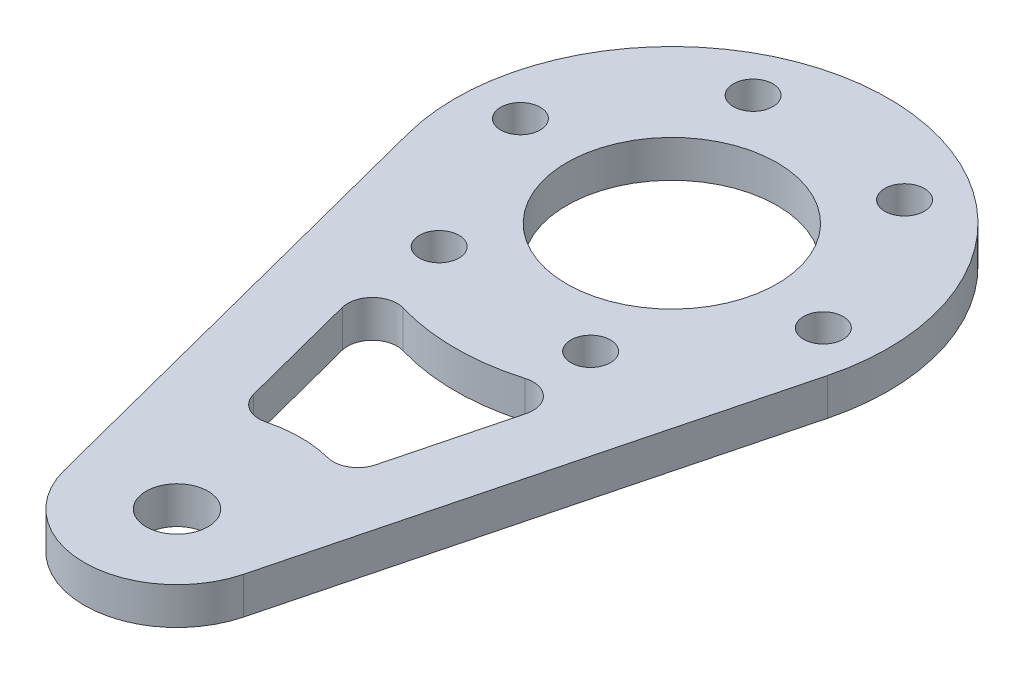
ISO-10303-21;
HEADER;
FILE_DESCRIPTION(('STEP AP214'),'2;1');
FILE_NAME('part.step','',(''),(''),'','','');
FILE_SCHEMA(('AUTOMOTIVE_DESIGN { 1 0 10303 214 1 1 1 1 }'));
ENDSEC;
DATA;
#1=APPLICATION_CONTEXT('core data for automotive mechanical design processes');
#2=APPLICATION_PROTOCOL_DEFINITION('international standard','automotive_design',2000,#1);
#3=PRODUCT_CONTEXT('',#1,'mechanical');
#4=PRODUCT('Part','Part','',(#3));
#5=PRODUCT_RELATED_PRODUCT_CATEGORY('part','',(#4));
#6=PRODUCT_DEFINITION_FORMATION('','',#4);
#7=PRODUCT_DEFINITION_CONTEXT('part definition',#1,'design');
#8=PRODUCT_DEFINITION('design','',#6,#7);
#9=PRODUCT_DEFINITION_SHAPE('','',#8);
#10=(LENGTH_UNIT() NAMED_UNIT(*) SI_UNIT(.MILLI.,.METRE.));
#11=(NAMED_UNIT(*) PLANE_ANGLE_UNIT() SI_UNIT($,.RADIAN.));
#12=(NAMED_UNIT(*) SI_UNIT($,.STERADIAN.) SOLID_ANGLE_UNIT());
#13=UNCERTAINTY_MEASURE_WITH_UNIT(LENGTH_MEASURE(1.E-05),#10,'distance_accuracy_value','');
#14=(GEOMETRIC_REPRESENTATION_CONTEXT(3) GLOBAL_UNCERTAINTY_ASSIGNED_CONTEXT((#13)) GLOBAL_UNIT_ASSIGNED_CONTEXT((#10,
#11,#12)) REPRESENTATION_CONTEXT('',''));
#15=CARTESIAN_POINT('',(0.,0.,0.));
#16=DIRECTION('',(0.,0.,1.));
#17=DIRECTION('',(1.,0.,0.));
#18=AXIS2_PLACEMENT_3D('',#15,#16,#17);
#19=CARTESIAN_POINT('',(0.,3.,0.));
#20=DIRECTION('',(0.,1.,0.));
#21=DIRECTION('',(0.,0.,1.));
#22=AXIS2_PLACEMENT_3D('',#19,#20,#21);
#23=PLANE('',#22);
#24=CARTESIAN_POINT('',(-13.4462676091566,3.,-1.20328192164592));
#25=DIRECTION('',(0.,1.,0.));
#26=DIRECTION('',(0.,0.,1.));
#27=AXIS2_PLACEMENT_3D('',#24,#25,#26);
#28=CIRCLE('',#27,1.6);
#29=CARTESIAN_POINT('',(-13.4462676091566,3.,0.396718078354082));
#30=VERTEX_POINT('',#29);
#31=EDGE_CURVE('E256',#30,#30,#28,.T.);
#32=ORIENTED_EDGE('',*,*,#31,.F.);
#33=EDGE_LOOP('',(#32));
#34=FACE_BOUND('',#33,.T.);
#35=CARTESIAN_POINT('',(7.76520651663615,3.,-11.0431683747928));
#36=DIRECTION('',(0.,1.,0.));
#37=DIRECTION('',(0.,0.,1.));
#38=AXIS2_PLACEMENT_3D('',#35,#36,#37);
#39=CIRCLE('',#38,1.6);
#40=CARTESIAN_POINT('',(7.76520651663615,3.,-9.44316837479283));
#41=VERTEX_POINT('',#40);
#42=EDGE_CURVE('E253',#41,#41,#39,.T.);
#43=ORIENTED_EDGE('',*,*,#42,.F.);
#44=EDGE_LOOP('',(#43));
#45=FACE_BOUND('',#44,.T.);
#46=CARTESIAN_POINT('',(5.68106109251934,3.,12.2464502964335));
#47=DIRECTION('',(0.,1.,0.));
#48=DIRECTION('',(0.,0.,1.));
#49=AXIS2_PLACEMENT_3D('',#46,#47,#48);
#50=CIRCLE('',#49,1.6);
#51=CARTESIAN_POINT('',(5.68106109251934,3.,13.8464502964335));
#52=VERTEX_POINT('',#51);
#53=EDGE_CURVE('E245',#52,#52,#50,.T.);
#54=ORIENTED_EDGE('',*,*,#53,.F.);
#55=EDGE_LOOP('',(#54));
#56=FACE_BOUND('',#55,.T.);
#57=CARTESIAN_POINT('',(13.4462676091566,3.,1.20328192164592));
#58=DIRECTION('',(0.,1.,0.));
#59=DIRECTION('',(0.,0.,1.));
#60=AXIS2_PLACEMENT_3D('',#57,#58,#59);
#61=CIRCLE('',#60,1.6);
#62=CARTESIAN_POINT('',(13.4462676091566,3.,2.80328192164592));
#63=VERTEX_POINT('',#62);
#64=EDGE_CURVE('E165',#63,#63,#61,.T.);
#65=ORIENTED_EDGE('',*,*,#64,.F.);
#66=EDGE_LOOP('',(#65));
#67=FACE_BOUND('',#66,.T.);
#68=CARTESIAN_POINT('',(0.,3.,0.));
#69=DIRECTION('',(0.,1.,0.));
#70=DIRECTION('',(0.,0.,1.));
#71=AXIS2_PLACEMENT_3D('',#68,#69,#70);
#72=CIRCLE('',#71,8.5);
#73=CARTESIAN_POINT('',(0.,3.,8.5));
#74=VERTEX_POINT('',#73);
#75=EDGE_CURVE('E277',#74,#74,#72,.T.);
#76=ORIENTED_EDGE('',*,*,#75,.F.);
#77=EDGE_LOOP('',(#76));
#78=FACE_BOUND('',#77,.T.);
#79=CARTESIAN_POINT('',(-7.76520651663615,3.,11.0431683747928));
#80=DIRECTION('',(0.,1.,0.));
#81=DIRECTION('',(0.,0.,1.));
#82=AXIS2_PLACEMENT_3D('',#79,#80,#81);
#83=CIRCLE('',#82,1.6);
#84=CARTESIAN_POINT('',(-7.76520651663615,3.,12.6431683747928));
#85=VERTEX_POINT('',#84);
#86=EDGE_CURVE('E274',#85,#85,#83,.T.);
#87=ORIENTED_EDGE('',*,*,#86,.F.);
#88=EDGE_LOOP('',(#87));
#89=FACE_BOUND('',#88,.T.);
#90=CARTESIAN_POINT('',(-5.68106109251934,3.,-12.2464502964335));
#91=DIRECTION('',(0.,1.,0.));
#92=DIRECTION('',(0.,0.,1.));
#93=AXIS2_PLACEMENT_3D('',#90,#91,#92);
#94=CIRCLE('',#93,1.6);
#95=CARTESIAN_POINT('',(-5.68106109251934,3.,-10.6464502964335));
#96=VERTEX_POINT('',#95);
#97=EDGE_CURVE('E263',#96,#96,#94,.T.);
#98=ORIENTED_EDGE('',*,*,#97,.F.);
#99=EDGE_LOOP('',(#98));
#100=FACE_BOUND('',#99,.T.);
#101=CARTESIAN_POINT('',(0.,3.,0.));
#102=DIRECTION('',(0.,1.,0.));
#103=DIRECTION('',(0.,0.,1.));
#104=AXIS2_PLACEMENT_3D('',#101,#102,#103);
#105=CIRCLE('',#104,17.5);
#106=CARTESIAN_POINT('',(16.9443021396575,3.,4.375));
#107=VERTEX_POINT('',#106);
#108=CARTESIAN_POINT('',(-16.9443021396575,3.,4.375));
#109=VERTEX_POINT('',#108);
#110=EDGE_CURVE('E128',#107,#109,#105,.T.);
#111=ORIENTED_EDGE('',*,*,#110,.T.);
#112=DIRECTION('',(-0.25,0.,-0.968245836551854));
#113=VECTOR('',#112,1.);
#114=CARTESIAN_POINT('',(-16.9443021396575,3.,4.375));
#115=LINE('',#114,#113);
#116=CARTESIAN_POINT('',(-7.26184377413891,3.,41.875));
#117=VERTEX_POINT('',#116);
#118=EDGE_CURVE('E132',#117,#109,#115,.T.);
#119=ORIENTED_EDGE('',*,*,#118,.F.);
#120=CARTESIAN_POINT('',(0.,3.,40.));
#121=DIRECTION('',(0.,1.,0.));
#122=DIRECTION('',(0.,0.,1.));
#123=AXIS2_PLACEMENT_3D('',#120,#121,#122);
#124=CIRCLE('',#123,7.5);
#125=CARTESIAN_POINT('',(7.26184377413891,3.,41.875));
#126=VERTEX_POINT('',#125);
#127=EDGE_CURVE('E153',#117,#126,#124,.T.);
#128=ORIENTED_EDGE('',*,*,#127,.T.);
#129=DIRECTION('',(0.25,0.,-0.968245836551854));
#130=VECTOR('',#129,1.);
#131=CARTESIAN_POINT('',(16.9443021396574,3.,4.375));
#132=LINE('',#131,#130);
#133=EDGE_CURVE('E134',#126,#107,#132,.T.);
#134=ORIENTED_EDGE('',*,*,#133,.T.);
#135=EDGE_LOOP('',(#111,#119,#128,#134));
#136=FACE_BOUND('',#135,.T.);
#137=CARTESIAN_POINT('',(0.,3.,40.));
#138=DIRECTION('',(0.,1.,0.));
#139=DIRECTION('',(0.,0.,1.));
#140=AXIS2_PLACEMENT_3D('',#137,#138,#139);
#141=CIRCLE('',#140,2.5);
#142=CARTESIAN_POINT('',(0.,3.,42.5));
#143=VERTEX_POINT('',#142);
#144=EDGE_CURVE('E159',#143,#143,#141,.T.);
#145=ORIENTED_EDGE('',*,*,#144,.F.);
#146=EDGE_LOOP('',(#145));
#147=FACE_BOUND('',#146,.T.);
#148=DIRECTION('',(0.25,0.,-0.968245836551854));
#149=VECTOR('',#148,1.);
#150=CARTESIAN_POINT('',(11.6189500386223,3.,3.00000000000001));
#151=LINE('',#150,#149);
#152=CARTESIAN_POINT('',(4.93649167310371,3.,28.8810499613778));
#153=VERTEX_POINT('',#152);
#154=CARTESIAN_POINT('',(7.43378277792645,3.,19.2090831017674));
#155=VERTEX_POINT('',#154);
#156=EDGE_CURVE('E231',#153,#155,#151,.T.);
#157=ORIENTED_EDGE('',*,*,#156,.F.);
#158=CARTESIAN_POINT('',(3.,3.,28.3810499613777));
#159=DIRECTION('',(0.,1.,0.));
#160=DIRECTION('',(0.,0.,1.));
#161=AXIS2_PLACEMENT_3D('',#158,#159,#160);
#162=CIRCLE('',#161,2.);
#163=CARTESIAN_POINT('',(2.5,3.,30.3175416344815));
#164=VERTEX_POINT('',#163);
#165=EDGE_CURVE('E60',#153,#164,#162,.F.);
#166=ORIENTED_EDGE('',*,*,#165,.T.);
#167=CARTESIAN_POINT('',(0.,3.,40.));
#168=DIRECTION('',(0.,1.,0.));
#169=DIRECTION('',(0.,0.,1.));
#170=AXIS2_PLACEMENT_3D('',#167,#168,#169);
#171=CIRCLE('',#170,10.);
#172=CARTESIAN_POINT('',(-2.5,3.,30.3175416344815));
#173=VERTEX_POINT('',#172);
#174=EDGE_CURVE('E223',#164,#173,#171,.T.);
#175=ORIENTED_EDGE('',*,*,#174,.T.);
#176=CARTESIAN_POINT('',(-3.,3.,28.3810499613777));
#177=DIRECTION('',(0.,1.,0.));
#178=DIRECTION('',(0.,0.,1.));
#179=AXIS2_PLACEMENT_3D('',#176,#177,#178);
#180=CIRCLE('',#179,2.);
#181=CARTESIAN_POINT('',(-4.93649167310371,3.,28.8810499613778));
#182=VERTEX_POINT('',#181);
#183=EDGE_CURVE('E11',#173,#182,#180,.F.);
#184=ORIENTED_EDGE('',*,*,#183,.T.);
#185=DIRECTION('',(-0.25,0.,-0.968245836551854));
#186=VECTOR('',#185,1.);
#187=CARTESIAN_POINT('',(-11.6189500386223,3.,3.));
#188=LINE('',#187,#186);
#189=CARTESIAN_POINT('',(-7.43378277792645,3.,19.2090831017674));
#190=VERTEX_POINT('',#189);
#191=EDGE_CURVE('E221',#182,#190,#188,.T.);
#192=ORIENTED_EDGE('',*,*,#191,.T.);
#193=CARTESIAN_POINT('',(-5.49729110482274,3.,18.7090831017674));
#194=DIRECTION('',(0.,1.,0.));
#195=DIRECTION('',(0.,0.,1.));
#196=AXIS2_PLACEMENT_3D('',#193,#194,#195);
#197=CIRCLE('',#196,2.);
#198=CARTESIAN_POINT('',(-4.93346637612297,3.,16.7902027836374));
#199=VERTEX_POINT('',#198);
#200=EDGE_CURVE('E202',#190,#199,#197,.F.);
#201=ORIENTED_EDGE('',*,*,#200,.T.);
#202=CARTESIAN_POINT('',(0.,3.,0.));
#203=DIRECTION('',(0.,1.,0.));
#204=DIRECTION('',(0.,0.,1.));
#205=AXIS2_PLACEMENT_3D('',#202,#203,#204);
#206=CIRCLE('',#205,17.5);
#207=CARTESIAN_POINT('',(4.93346637612298,3.,16.7902027836374));
#208=VERTEX_POINT('',#207);
#209=EDGE_CURVE('E227',#199,#208,#206,.T.);
#210=ORIENTED_EDGE('',*,*,#209,.T.);
#211=CARTESIAN_POINT('',(5.49729110482275,3.,18.7090831017674));
#212=DIRECTION('',(0.,1.,0.));
#213=DIRECTION('',(0.,0.,1.));
#214=AXIS2_PLACEMENT_3D('',#211,#212,#213);
#215=CIRCLE('',#214,2.);
#216=EDGE_CURVE('E198',#208,#155,#215,.F.);
#217=ORIENTED_EDGE('',*,*,#216,.T.);
#218=EDGE_LOOP('',(#157,#166,#175,#184,#192,#201,#210,#217));
#219=FACE_BOUND('',#218,.T.);
#220=ADVANCED_FACE('F38',(#34,#45,#56,#67,#78,#89,#100,#136,#147,#219),#23,.T.);
#221=CARTESIAN_POINT('',(0.,0.,0.));
#222=DIRECTION('',(0.,1.,0.));
#223=DIRECTION('',(0.,0.,1.));
#224=AXIS2_PLACEMENT_3D('',#221,#222,#223);
#225=PLANE('',#224);
#226=CARTESIAN_POINT('',(0.,0.,40.));
#227=DIRECTION('',(0.,1.,0.));
#228=DIRECTION('',(0.,0.,1.));
#229=AXIS2_PLACEMENT_3D('',#226,#227,#228);
#230=CIRCLE('',#229,2.5);
#231=CARTESIAN_POINT('',(0.,0.,42.5));
#232=VERTEX_POINT('',#231);
#233=EDGE_CURVE('E138',#232,#232,#230,.T.);
#234=ORIENTED_EDGE('',*,*,#233,.T.);
#235=EDGE_LOOP('',(#234));
#236=FACE_BOUND('',#235,.T.);
#237=CARTESIAN_POINT('',(0.,0.,0.));
#238=DIRECTION('',(0.,1.,0.));
#239=DIRECTION('',(0.,0.,1.));
#240=AXIS2_PLACEMENT_3D('',#237,#238,#239);
#241=CIRCLE('',#240,17.5);
#242=CARTESIAN_POINT('',(16.9443021396575,0.,4.375));
#243=VERTEX_POINT('',#242);
#244=CARTESIAN_POINT('',(-16.9443021396575,0.,4.375));
#245=VERTEX_POINT('',#244);
#246=EDGE_CURVE('E144',#243,#245,#241,.T.);
#247=ORIENTED_EDGE('',*,*,#246,.F.);
#248=DIRECTION('',(0.25,0.,-0.968245836551854));
#249=VECTOR('',#248,1.);
#250=CARTESIAN_POINT('',(16.9443021396574,0.,4.375));
#251=LINE('',#250,#249);
#252=CARTESIAN_POINT('',(7.26184377413891,0.,41.875));
#253=VERTEX_POINT('',#252);
#254=EDGE_CURVE('E169',#253,#243,#251,.T.);
#255=ORIENTED_EDGE('',*,*,#254,.F.);
#256=CARTESIAN_POINT('',(0.,0.,40.));
#257=DIRECTION('',(0.,1.,0.));
#258=DIRECTION('',(0.,0.,1.));
#259=AXIS2_PLACEMENT_3D('',#256,#257,#258);
#260=CIRCLE('',#259,7.5);
#261=CARTESIAN_POINT('',(-7.26184377413891,0.,41.875));
#262=VERTEX_POINT('',#261);
#263=EDGE_CURVE('E167',#262,#253,#260,.T.);
#264=ORIENTED_EDGE('',*,*,#263,.F.);
#265=DIRECTION('',(-0.25,0.,-0.968245836551854));
#266=VECTOR('',#265,1.);
#267=CARTESIAN_POINT('',(-16.9443021396575,0.,4.375));
#268=LINE('',#267,#266);
#269=EDGE_CURVE('E164',#262,#245,#268,.T.);
#270=ORIENTED_EDGE('',*,*,#269,.T.);
#271=EDGE_LOOP('',(#247,#255,#264,#270));
#272=FACE_BOUND('',#271,.T.);
#273=CARTESIAN_POINT('',(-5.68106109251934,0.,-12.2464502964335));
#274=DIRECTION('',(0.,-1.,0.));
#275=DIRECTION('',(0.,0.,-1.));
#276=AXIS2_PLACEMENT_3D('',#273,#274,#275);
#277=CIRCLE('',#276,1.6);
#278=CARTESIAN_POINT('',(-5.68106109251934,0.,-13.8464502964335));
#279=VERTEX_POINT('',#278);
#280=EDGE_CURVE('E264',#279,#279,#277,.T.);
#281=ORIENTED_EDGE('',*,*,#280,.F.);
#282=EDGE_LOOP('',(#281));
#283=FACE_BOUND('',#282,.T.);
#284=CARTESIAN_POINT('',(-7.76520651663615,0.,11.0431683747928));
#285=DIRECTION('',(0.,-1.,0.));
#286=DIRECTION('',(0.,0.,-1.));
#287=AXIS2_PLACEMENT_3D('',#284,#285,#286);
#288=CIRCLE('',#287,1.6);
#289=CARTESIAN_POINT('',(-7.76520651663615,0.,9.44316837479283));
#290=VERTEX_POINT('',#289);
#291=EDGE_CURVE('E267',#290,#290,#288,.T.);
#292=ORIENTED_EDGE('',*,*,#291,.F.);
#293=EDGE_LOOP('',(#292));
#294=FACE_BOUND('',#293,.T.);
#295=CARTESIAN_POINT('',(0.,0.,0.));
#296=DIRECTION('',(0.,-1.,0.));
#297=DIRECTION('',(0.,0.,-1.));
#298=AXIS2_PLACEMENT_3D('',#295,#296,#297);
#299=CIRCLE('',#298,8.5);
#300=CARTESIAN_POINT('',(0.,0.,-8.5));
#301=VERTEX_POINT('',#300);
#302=EDGE_CURVE('E259',#301,#301,#299,.T.);
#303=ORIENTED_EDGE('',*,*,#302,.F.);
#304=EDGE_LOOP('',(#303));
#305=FACE_BOUND('',#304,.T.);
#306=CARTESIAN_POINT('',(13.4462676091566,0.,1.20328192164592));
#307=DIRECTION('',(0.,-1.,0.));
#308=DIRECTION('',(0.,0.,-1.));
#309=AXIS2_PLACEMENT_3D('',#306,#307,#308);
#310=CIRCLE('',#309,1.6);
#311=CARTESIAN_POINT('',(13.4462676091566,0.,-0.396718078354082));
#312=VERTEX_POINT('',#311);
#313=EDGE_CURVE('E260',#312,#312,#310,.T.);
#314=ORIENTED_EDGE('',*,*,#313,.F.);
#315=EDGE_LOOP('',(#314));
#316=FACE_BOUND('',#315,.T.);
#317=CARTESIAN_POINT('',(5.68106109251934,0.,12.2464502964335));
#318=DIRECTION('',(0.,-1.,0.));
#319=DIRECTION('',(0.,0.,1.));
#320=AXIS2_PLACEMENT_3D('',#317,#318,#319);
#321=CIRCLE('',#320,1.6);
#322=CARTESIAN_POINT('',(5.68106109251934,0.,13.8464502964335));
#323=VERTEX_POINT('',#322);
#324=EDGE_CURVE('E246',#323,#323,#321,.T.);
#325=ORIENTED_EDGE('',*,*,#324,.F.);
#326=EDGE_LOOP('',(#325));
#327=FACE_BOUND('',#326,.T.);
#328=CARTESIAN_POINT('',(7.76520651663615,0.,-11.0431683747928));
#329=DIRECTION('',(0.,-1.,0.));
#330=DIRECTION('',(0.,0.,1.));
#331=AXIS2_PLACEMENT_3D('',#328,#329,#330);
#332=CIRCLE('',#331,1.6);
#333=CARTESIAN_POINT('',(7.76520651663615,0.,-9.44316837479283));
#334=VERTEX_POINT('',#333);
#335=EDGE_CURVE('E241',#334,#334,#332,.T.);
#336=ORIENTED_EDGE('',*,*,#335,.F.);
#337=EDGE_LOOP('',(#336));
#338=FACE_BOUND('',#337,.T.);
#339=CARTESIAN_POINT('',(-13.4462676091566,0.,-1.20328192164592));
#340=DIRECTION('',(0.,-1.,0.));
#341=DIRECTION('',(0.,0.,1.));
#342=AXIS2_PLACEMENT_3D('',#339,#340,#341);
#343=CIRCLE('',#342,1.6);
#344=CARTESIAN_POINT('',(-13.4462676091566,0.,0.396718078354082));
#345=VERTEX_POINT('',#344);
#346=EDGE_CURVE('E242',#345,#345,#343,.T.);
#347=ORIENTED_EDGE('',*,*,#346,.F.);
#348=EDGE_LOOP('',(#347));
#349=FACE_BOUND('',#348,.T.);
#350=DIRECTION('',(0.25,0.,0.968245836551854));
#351=VECTOR('',#350,1.);
#352=CARTESIAN_POINT('',(-11.6189500386223,0.,3.));
#353=LINE('',#352,#351);
#354=CARTESIAN_POINT('',(-7.43378277792645,0.,19.2090831017674));
#355=VERTEX_POINT('',#354);
#356=CARTESIAN_POINT('',(-4.93649167310371,0.,28.8810499613778));
#357=VERTEX_POINT('',#356);
#358=EDGE_CURVE('E212',#355,#357,#353,.T.);
#359=ORIENTED_EDGE('',*,*,#358,.T.);
#360=CARTESIAN_POINT('',(-3.,0.,28.3810499613777));
#361=DIRECTION('',(0.,1.,0.));
#362=DIRECTION('',(0.,0.,1.));
#363=AXIS2_PLACEMENT_3D('',#360,#361,#362);
#364=CIRCLE('',#363,2.);
#365=CARTESIAN_POINT('',(-2.5,0.,30.3175416344815));
#366=VERTEX_POINT('',#365);
#367=EDGE_CURVE('E46',#357,#366,#364,.T.);
#368=ORIENTED_EDGE('',*,*,#367,.T.);
#369=CARTESIAN_POINT('',(0.,0.,40.));
#370=DIRECTION('',(0.,-1.,0.));
#371=DIRECTION('',(0.,0.,-1.));
#372=AXIS2_PLACEMENT_3D('',#369,#370,#371);
#373=CIRCLE('',#372,10.);
#374=CARTESIAN_POINT('',(2.5,0.,30.3175416344815));
#375=VERTEX_POINT('',#374);
#376=EDGE_CURVE('E210',#366,#375,#373,.T.);
#377=ORIENTED_EDGE('',*,*,#376,.T.);
#378=CARTESIAN_POINT('',(3.,0.,28.3810499613777));
#379=DIRECTION('',(0.,1.,0.));
#380=DIRECTION('',(0.,0.,1.));
#381=AXIS2_PLACEMENT_3D('',#378,#379,#380);
#382=CIRCLE('',#381,2.);
#383=CARTESIAN_POINT('',(4.93649167310371,0.,28.8810499613778));
#384=VERTEX_POINT('',#383);
#385=EDGE_CURVE('E204',#375,#384,#382,.T.);
#386=ORIENTED_EDGE('',*,*,#385,.T.);
#387=DIRECTION('',(-0.25,0.,0.968245836551854));
#388=VECTOR('',#387,1.);
#389=CARTESIAN_POINT('',(11.6189500386223,0.,3.00000000000001));
#390=LINE('',#389,#388);
#391=CARTESIAN_POINT('',(7.43378277792645,0.,19.2090831017674));
#392=VERTEX_POINT('',#391);
#393=EDGE_CURVE('E228',#392,#384,#390,.T.);
#394=ORIENTED_EDGE('',*,*,#393,.F.);
#395=CARTESIAN_POINT('',(5.49729110482275,0.,18.7090831017674));
#396=DIRECTION('',(0.,1.,0.));
#397=DIRECTION('',(0.,0.,1.));
#398=AXIS2_PLACEMENT_3D('',#395,#396,#397);
#399=CIRCLE('',#398,2.);
#400=CARTESIAN_POINT('',(4.93346637612298,0.,16.7902027836374));
#401=VERTEX_POINT('',#400);
#402=EDGE_CURVE('E196',#392,#401,#399,.T.);
#403=ORIENTED_EDGE('',*,*,#402,.T.);
#404=CARTESIAN_POINT('',(0.,0.,0.));
#405=DIRECTION('',(0.,-1.,0.));
#406=DIRECTION('',(0.,0.,-1.));
#407=AXIS2_PLACEMENT_3D('',#404,#405,#406);
#408=CIRCLE('',#407,17.5);
#409=CARTESIAN_POINT('',(-4.93346637612297,0.,16.7902027836374));
#410=VERTEX_POINT('',#409);
#411=EDGE_CURVE('E234',#401,#410,#408,.T.);
#412=ORIENTED_EDGE('',*,*,#411,.T.);
#413=CARTESIAN_POINT('',(-5.49729110482274,0.,18.7090831017674));
#414=DIRECTION('',(0.,1.,0.));
#415=DIRECTION('',(0.,0.,1.));
#416=AXIS2_PLACEMENT_3D('',#413,#414,#415);
#417=CIRCLE('',#416,2.);
#418=EDGE_CURVE('E200',#410,#355,#417,.T.);
#419=ORIENTED_EDGE('',*,*,#418,.T.);
#420=EDGE_LOOP('',(#359,#368,#377,#386,#394,#403,#412,#419));
#421=FACE_BOUND('',#420,.T.);
#422=ADVANCED_FACE('F209',(#236,#272,#283,#294,#305,#316,#327,#338,#349,#421),#225,.F.);
#423=CARTESIAN_POINT('',(0.,3.,0.));
#424=DIRECTION('',(0.,-1.,0.));
#425=DIRECTION('',(0.,0.,-1.));
#426=AXIS2_PLACEMENT_3D('',#423,#424,#425);
#427=CYLINDRICAL_SURFACE('',#426,17.5);
#428=ORIENTED_EDGE('',*,*,#246,.T.);
#429=DIRECTION('',(0.,-1.,0.));
#430=VECTOR('',#429,1.);
#431=CARTESIAN_POINT('',(-16.9443021396575,3.,4.375));
#432=LINE('',#431,#430);
#433=EDGE_CURVE('E141',#109,#245,#432,.T.);
#434=ORIENTED_EDGE('',*,*,#433,.F.);
#435=ORIENTED_EDGE('',*,*,#110,.F.);
#436=DIRECTION('',(0.,-1.,0.));
#437=VECTOR('',#436,1.);
#438=CARTESIAN_POINT('',(16.9443021396575,3.,4.375));
#439=LINE('',#438,#437);
#440=EDGE_CURVE('E162',#107,#243,#439,.T.);
#441=ORIENTED_EDGE('',*,*,#440,.T.);
#442=EDGE_LOOP('',(#428,#434,#435,#441));
#443=FACE_BOUND('',#442,.T.);
#444=ADVANCED_FACE('F142',(#443),#427,.T.);
#445=CARTESIAN_POINT('',(-16.9443021396575,3.,4.375));
#446=DIRECTION('',(-0.968245836551854,0.,0.25));
#447=DIRECTION('',(0.25,0.,0.968245836551854));
#448=AXIS2_PLACEMENT_3D('',#445,#446,#447);
#449=PLANE('',#448);
#450=ORIENTED_EDGE('',*,*,#269,.F.);
#451=DIRECTION('',(0.,-1.,0.));
#452=VECTOR('',#451,1.);
#453=CARTESIAN_POINT('',(-7.26184377413891,3.,41.875));
#454=LINE('',#453,#452);
#455=EDGE_CURVE('E149',#117,#262,#454,.T.);
#456=ORIENTED_EDGE('',*,*,#455,.F.);
#457=ORIENTED_EDGE('',*,*,#118,.T.);
#458=ORIENTED_EDGE('',*,*,#433,.T.);
#459=EDGE_LOOP('',(#450,#456,#457,#458));
#460=FACE_BOUND('',#459,.T.);
#461=ADVANCED_FACE('F151',(#460),#449,.T.);
#462=CARTESIAN_POINT('',(0.,3.,40.));
#463=DIRECTION('',(0.,-1.,0.));
#464=DIRECTION('',(0.,0.,-1.));
#465=AXIS2_PLACEMENT_3D('',#462,#463,#464);
#466=CYLINDRICAL_SURFACE('',#465,7.5);
#467=ORIENTED_EDGE('',*,*,#263,.T.);
#468=DIRECTION('',(0.,-1.,0.));
#469=VECTOR('',#468,1.);
#470=CARTESIAN_POINT('',(7.26184377413891,3.,41.875));
#471=LINE('',#470,#469);
#472=EDGE_CURVE('E174',#126,#253,#471,.T.);
#473=ORIENTED_EDGE('',*,*,#472,.F.);
#474=ORIENTED_EDGE('',*,*,#127,.F.);
#475=ORIENTED_EDGE('',*,*,#455,.T.);
#476=EDGE_LOOP('',(#467,#473,#474,#475));
#477=FACE_BOUND('',#476,.T.);
#478=ADVANCED_FACE('F353',(#477),#466,.T.);
#479=CARTESIAN_POINT('',(16.9443021396574,3.,4.375));
#480=DIRECTION('',(-0.968245836551854,0.,-0.25));
#481=DIRECTION('',(-0.25,0.,0.968245836551854));
#482=AXIS2_PLACEMENT_3D('',#479,#480,#481);
#483=PLANE('',#482);
#484=ORIENTED_EDGE('',*,*,#254,.T.);
#485=ORIENTED_EDGE('',*,*,#440,.F.);
#486=ORIENTED_EDGE('',*,*,#133,.F.);
#487=ORIENTED_EDGE('',*,*,#472,.T.);
#488=EDGE_LOOP('',(#484,#485,#486,#487));
#489=FACE_BOUND('',#488,.T.);
#490=ADVANCED_FACE('F349',(#489),#483,.F.);
#491=CARTESIAN_POINT('',(0.,3.,40.));
#492=DIRECTION('',(0.,-1.,0.));
#493=DIRECTION('',(0.,0.,-1.));
#494=AXIS2_PLACEMENT_3D('',#491,#492,#493);
#495=CYLINDRICAL_SURFACE('',#494,2.5);
#496=ORIENTED_EDGE('',*,*,#144,.T.);
#497=EDGE_LOOP('',(#496));
#498=FACE_BOUND('',#497,.T.);
#499=ORIENTED_EDGE('',*,*,#233,.F.);
#500=EDGE_LOOP('',(#499));
#501=FACE_BOUND('',#500,.T.);
#502=ADVANCED_FACE('F299',(#498,#501),#495,.F.);
#503=CARTESIAN_POINT('',(-5.68106109251934,4.,-12.2464502964335));
#504=DIRECTION('',(0.,-1.,0.));
#505=DIRECTION('',(0.,0.,-1.));
#506=AXIS2_PLACEMENT_3D('',#503,#504,#505);
#507=CYLINDRICAL_SURFACE('',#506,1.6);
#508=ORIENTED_EDGE('',*,*,#97,.T.);
#509=EDGE_LOOP('',(#508));
#510=FACE_BOUND('',#509,.T.);
#511=ORIENTED_EDGE('',*,*,#280,.T.);
#512=EDGE_LOOP('',(#511));
#513=FACE_BOUND('',#512,.T.);
#514=ADVANCED_FACE('F295',(#510,#513),#507,.F.);
#515=CARTESIAN_POINT('',(-7.76520651663615,4.,11.0431683747928));
#516=DIRECTION('',(0.,-1.,0.));
#517=DIRECTION('',(0.,0.,-1.));
#518=AXIS2_PLACEMENT_3D('',#515,#516,#517);
#519=CYLINDRICAL_SURFACE('',#518,1.6);
#520=ORIENTED_EDGE('',*,*,#86,.T.);
#521=EDGE_LOOP('',(#520));
#522=FACE_BOUND('',#521,.T.);
#523=ORIENTED_EDGE('',*,*,#291,.T.);
#524=EDGE_LOOP('',(#523));
#525=FACE_BOUND('',#524,.T.);
#526=ADVANCED_FACE('F298',(#522,#525),#519,.F.);
#527=CARTESIAN_POINT('',(0.,4.,0.));
#528=DIRECTION('',(0.,-1.,0.));
#529=DIRECTION('',(0.,0.,-1.));
#530=AXIS2_PLACEMENT_3D('',#527,#528,#529);
#531=CYLINDRICAL_SURFACE('',#530,8.5);
#532=ORIENTED_EDGE('',*,*,#75,.T.);
#533=EDGE_LOOP('',(#532));
#534=FACE_BOUND('',#533,.T.);
#535=ORIENTED_EDGE('',*,*,#302,.T.);
#536=EDGE_LOOP('',(#535));
#537=FACE_BOUND('',#536,.T.);
#538=ADVANCED_FACE('F340',(#534,#537),#531,.F.);
#539=CARTESIAN_POINT('',(13.4462676091566,4.,1.20328192164592));
#540=DIRECTION('',(0.,-1.,0.));
#541=DIRECTION('',(0.,0.,-1.));
#542=AXIS2_PLACEMENT_3D('',#539,#540,#541);
#543=CYLINDRICAL_SURFACE('',#542,1.6);
#544=ORIENTED_EDGE('',*,*,#64,.T.);
#545=EDGE_LOOP('',(#544));
#546=FACE_BOUND('',#545,.T.);
#547=ORIENTED_EDGE('',*,*,#313,.T.);
#548=EDGE_LOOP('',(#547));
#549=FACE_BOUND('',#548,.T.);
#550=ADVANCED_FACE('F282',(#546,#549),#543,.F.);
#551=CARTESIAN_POINT('',(5.68106109251934,4.,12.2464502964335));
#552=DIRECTION('',(0.,-1.,0.));
#553=DIRECTION('',(0.,0.,-1.));
#554=AXIS2_PLACEMENT_3D('',#551,#552,#553);
#555=CYLINDRICAL_SURFACE('',#554,1.6);
#556=ORIENTED_EDGE('',*,*,#53,.T.);
#557=EDGE_LOOP('',(#556));
#558=FACE_BOUND('',#557,.T.);
#559=ORIENTED_EDGE('',*,*,#324,.T.);
#560=EDGE_LOOP('',(#559));
#561=FACE_BOUND('',#560,.T.);
#562=ADVANCED_FACE('F330',(#558,#561),#555,.F.);
#563=CARTESIAN_POINT('',(7.76520651663615,4.,-11.0431683747928));
#564=DIRECTION('',(0.,-1.,0.));
#565=DIRECTION('',(0.,0.,-1.));
#566=AXIS2_PLACEMENT_3D('',#563,#564,#565);
#567=CYLINDRICAL_SURFACE('',#566,1.6);
#568=ORIENTED_EDGE('',*,*,#42,.T.);
#569=EDGE_LOOP('',(#568));
#570=FACE_BOUND('',#569,.T.);
#571=ORIENTED_EDGE('',*,*,#335,.T.);
#572=EDGE_LOOP('',(#571));
#573=FACE_BOUND('',#572,.T.);
#574=ADVANCED_FACE('F321',(#570,#573),#567,.F.);
#575=CARTESIAN_POINT('',(-13.4462676091566,4.,-1.20328192164592));
#576=DIRECTION('',(0.,-1.,0.));
#577=DIRECTION('',(0.,0.,-1.));
#578=AXIS2_PLACEMENT_3D('',#575,#576,#577);
#579=CYLINDRICAL_SURFACE('',#578,1.6);
#580=ORIENTED_EDGE('',*,*,#31,.T.);
#581=EDGE_LOOP('',(#580));
#582=FACE_BOUND('',#581,.T.);
#583=ORIENTED_EDGE('',*,*,#346,.T.);
#584=EDGE_LOOP('',(#583));
#585=FACE_BOUND('',#584,.T.);
#586=ADVANCED_FACE('F319',(#582,#585),#579,.F.);
#587=CARTESIAN_POINT('',(0.,4.,40.));
#588=DIRECTION('',(0.,-1.,0.));
#589=DIRECTION('',(0.,0.,-1.));
#590=AXIS2_PLACEMENT_3D('',#587,#588,#589);
#591=CYLINDRICAL_SURFACE('',#590,10.);
#592=ORIENTED_EDGE('',*,*,#174,.F.);
#593=DIRECTION('',(0.,-1.,0.));
#594=VECTOR('',#593,1.);
#595=CARTESIAN_POINT('',(2.5,4.,30.3175416344815));
#596=LINE('',#595,#594);
#597=EDGE_CURVE('E193',#164,#375,#596,.T.);
#598=ORIENTED_EDGE('',*,*,#597,.T.);
#599=ORIENTED_EDGE('',*,*,#376,.F.);
#600=DIRECTION('',(0.,-1.,0.));
#601=VECTOR('',#600,1.);
#602=CARTESIAN_POINT('',(-2.5,4.,30.3175416344815));
#603=LINE('',#602,#601);
#604=EDGE_CURVE('E53',#366,#173,#603,.F.);
#605=ORIENTED_EDGE('',*,*,#604,.T.);
#606=EDGE_LOOP('',(#592,#598,#599,#605));
#607=FACE_BOUND('',#606,.T.);
#608=ADVANCED_FACE('F215',(#607),#591,.T.);
#609=CARTESIAN_POINT('',(11.6189500386223,4.,3.00000000000001));
#610=DIRECTION('',(0.968245836551854,0.,0.25));
#611=DIRECTION('',(0.25,0.,-0.968245836551854));
#612=AXIS2_PLACEMENT_3D('',#609,#610,#611);
#613=PLANE('',#612);
#614=ORIENTED_EDGE('',*,*,#156,.T.);
#615=DIRECTION('',(0.,-1.,0.));
#616=VECTOR('',#615,1.);
#617=CARTESIAN_POINT('',(7.43378277792645,4.,19.2090831017674));
#618=LINE('',#617,#616);
#619=EDGE_CURVE('E179',#155,#392,#618,.T.);
#620=ORIENTED_EDGE('',*,*,#619,.T.);
#621=ORIENTED_EDGE('',*,*,#393,.T.);
#622=DIRECTION('',(0.,-1.,0.));
#623=VECTOR('',#622,1.);
#624=CARTESIAN_POINT('',(4.93649167310371,4.,28.8810499613778));
#625=LINE('',#624,#623);
#626=EDGE_CURVE('E148',#384,#153,#625,.F.);
#627=ORIENTED_EDGE('',*,*,#626,.T.);
#628=EDGE_LOOP('',(#614,#620,#621,#627));
#629=FACE_BOUND('',#628,.T.);
#630=ADVANCED_FACE('F328',(#629),#613,.F.);
#631=CARTESIAN_POINT('',(0.,4.,0.));
#632=DIRECTION('',(0.,-1.,0.));
#633=DIRECTION('',(0.,0.,-1.));
#634=AXIS2_PLACEMENT_3D('',#631,#632,#633);
#635=CYLINDRICAL_SURFACE('',#634,17.5);
#636=ORIENTED_EDGE('',*,*,#411,.F.);
#637=DIRECTION('',(0.,-1.,0.));
#638=VECTOR('',#637,1.);
#639=CARTESIAN_POINT('',(4.93346637612298,4.,16.7902027836374));
#640=LINE('',#639,#638);
#641=EDGE_CURVE('E185',#401,#208,#640,.F.);
#642=ORIENTED_EDGE('',*,*,#641,.T.);
#643=ORIENTED_EDGE('',*,*,#209,.F.);
#644=DIRECTION('',(0.,-1.,0.));
#645=VECTOR('',#644,1.);
#646=CARTESIAN_POINT('',(-4.93346637612297,4.,16.7902027836374));
#647=LINE('',#646,#645);
#648=EDGE_CURVE('E182',#199,#410,#647,.T.);
#649=ORIENTED_EDGE('',*,*,#648,.T.);
#650=EDGE_LOOP('',(#636,#642,#643,#649));
#651=FACE_BOUND('',#650,.T.);
#652=ADVANCED_FACE('F384',(#651),#635,.T.);
#653=CARTESIAN_POINT('',(-11.6189500386223,4.,3.));
#654=DIRECTION('',(0.968245836551854,0.,-0.25));
#655=DIRECTION('',(-0.25,0.,-0.968245836551854));
#656=AXIS2_PLACEMENT_3D('',#653,#654,#655);
#657=PLANE('',#656);
#658=ORIENTED_EDGE('',*,*,#358,.F.);
#659=DIRECTION('',(0.,1.,0.));
#660=VECTOR('',#659,1.);
#661=CARTESIAN_POINT('',(-7.43378277792645,3.,19.2090831017674));
#662=LINE('',#661,#660);
#663=EDGE_CURVE('E190',#355,#190,#662,.T.);
#664=ORIENTED_EDGE('',*,*,#663,.T.);
#665=ORIENTED_EDGE('',*,*,#191,.F.);
#666=DIRECTION('',(0.,1.,0.));
#667=VECTOR('',#666,1.);
#668=CARTESIAN_POINT('',(-4.93649167310371,0.,28.8810499613777));
#669=LINE('',#668,#667);
#670=EDGE_CURVE('E187',#182,#357,#669,.F.);
#671=ORIENTED_EDGE('',*,*,#670,.T.);
#672=EDGE_LOOP('',(#658,#664,#665,#671));
#673=FACE_BOUND('',#672,.T.);
#674=ADVANCED_FACE('F225',(#673),#657,.T.);
#675=CARTESIAN_POINT('',(5.49729110482275,4.,18.7090831017674));
#676=DIRECTION('',(0.,-1.,0.));
#677=DIRECTION('',(0.,0.,-1.));
#678=AXIS2_PLACEMENT_3D('',#675,#676,#677);
#679=CYLINDRICAL_SURFACE('',#678,2.);
#680=ORIENTED_EDGE('',*,*,#216,.F.);
#681=ORIENTED_EDGE('',*,*,#641,.F.);
#682=ORIENTED_EDGE('',*,*,#402,.F.);
#683=ORIENTED_EDGE('',*,*,#619,.F.);
#684=EDGE_LOOP('',(#680,#681,#682,#683));
#685=FACE_BOUND('',#684,.T.);
#686=ADVANCED_FACE('F362',(#685),#679,.F.);
#687=CARTESIAN_POINT('',(-5.49729110482274,4.,18.7090831017674));
#688=DIRECTION('',(0.,-1.,0.));
#689=DIRECTION('',(0.,0.,-1.));
#690=AXIS2_PLACEMENT_3D('',#687,#688,#689);
#691=CYLINDRICAL_SURFACE('',#690,2.);
#692=ORIENTED_EDGE('',*,*,#200,.F.);
#693=ORIENTED_EDGE('',*,*,#663,.F.);
#694=ORIENTED_EDGE('',*,*,#418,.F.);
#695=ORIENTED_EDGE('',*,*,#648,.F.);
#696=EDGE_LOOP('',(#692,#693,#694,#695));
#697=FACE_BOUND('',#696,.T.);
#698=ADVANCED_FACE('F365',(#697),#691,.F.);
#699=CARTESIAN_POINT('',(3.,4.,28.3810499613777));
#700=DIRECTION('',(0.,-1.,0.));
#701=DIRECTION('',(0.,0.,-1.));
#702=AXIS2_PLACEMENT_3D('',#699,#700,#701);
#703=CYLINDRICAL_SURFACE('',#702,2.);
#704=ORIENTED_EDGE('',*,*,#165,.F.);
#705=ORIENTED_EDGE('',*,*,#626,.F.);
#706=ORIENTED_EDGE('',*,*,#385,.F.);
#707=ORIENTED_EDGE('',*,*,#597,.F.);
#708=EDGE_LOOP('',(#704,#705,#706,#707));
#709=FACE_BOUND('',#708,.T.);
#710=ADVANCED_FACE('F368',(#709),#703,.F.);
#711=CARTESIAN_POINT('',(-3.,4.,28.3810499613777));
#712=DIRECTION('',(0.,-1.,0.));
#713=DIRECTION('',(0.,0.,-1.));
#714=AXIS2_PLACEMENT_3D('',#711,#712,#713);
#715=CYLINDRICAL_SURFACE('',#714,2.);
#716=ORIENTED_EDGE('',*,*,#183,.F.);
#717=ORIENTED_EDGE('',*,*,#604,.F.);
#718=ORIENTED_EDGE('',*,*,#367,.F.);
#719=ORIENTED_EDGE('',*,*,#670,.F.);
#720=EDGE_LOOP('',(#716,#717,#718,#719));
#721=FACE_BOUND('',#720,.T.);
#722=ADVANCED_FACE('F40',(#721),#715,.F.);
#723=CLOSED_SHELL('',(#220,#422,#444,#461,#478,#490,#502,#514,#526,#538,#550,#562,#574,#586,
#608,#630,#652,#674,#686,#698,#710,#722));
#724=MANIFOLD_SOLID_BREP('B2',#723);
#725=ADVANCED_BREP_SHAPE_REPRESENTATION('',(#18,#724),#14);
#726=SHAPE_DEFINITION_REPRESENTATION(#9,#725);
ENDSEC;
END-ISO-10303-21;
